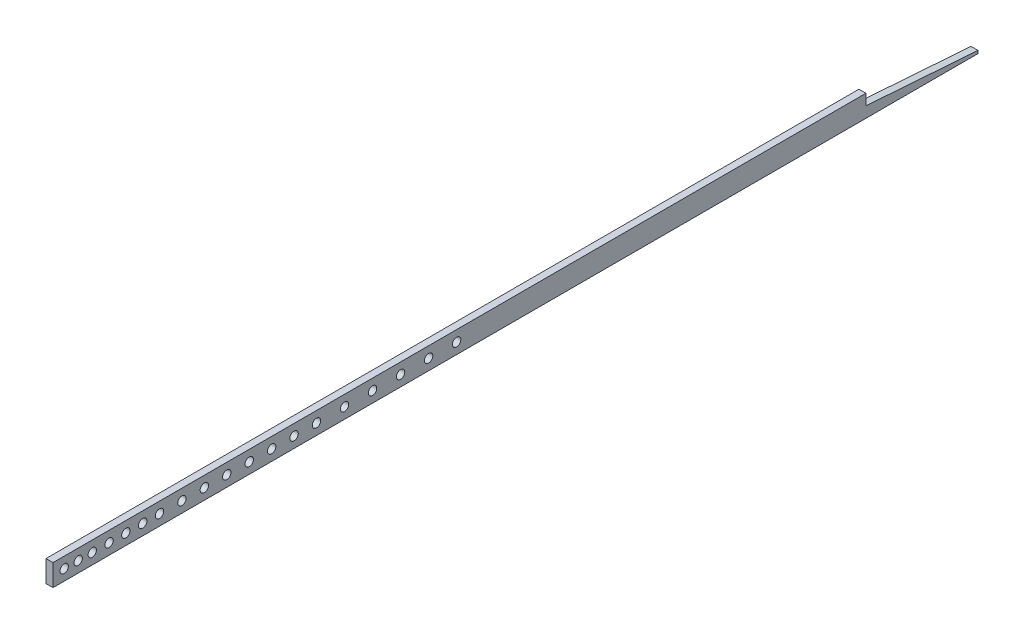
ISO-10303-21;
HEADER;
FILE_DESCRIPTION(('STEP AP214'),'2;1');
FILE_NAME('part.step','',(''),(''),'','','');
FILE_SCHEMA(('AUTOMOTIVE_DESIGN { 1 0 10303 214 1 1 1 1 }'));
ENDSEC;
DATA;
#1=APPLICATION_CONTEXT('core data for automotive mechanical design processes');
#2=APPLICATION_PROTOCOL_DEFINITION('international standard','automotive_design',2000,#1);
#3=PRODUCT_CONTEXT('',#1,'mechanical');
#4=PRODUCT('Part','Part','',(#3));
#5=PRODUCT_RELATED_PRODUCT_CATEGORY('part','',(#4));
#6=PRODUCT_DEFINITION_FORMATION('','',#4);
#7=PRODUCT_DEFINITION_CONTEXT('part definition',#1,'design');
#8=PRODUCT_DEFINITION('design','',#6,#7);
#9=PRODUCT_DEFINITION_SHAPE('','',#8);
#10=(LENGTH_UNIT() NAMED_UNIT(*) SI_UNIT(.MILLI.,.METRE.));
#11=(NAMED_UNIT(*) PLANE_ANGLE_UNIT() SI_UNIT($,.RADIAN.));
#12=(NAMED_UNIT(*) SI_UNIT($,.STERADIAN.) SOLID_ANGLE_UNIT());
#13=UNCERTAINTY_MEASURE_WITH_UNIT(LENGTH_MEASURE(1.E-05),#10,'distance_accuracy_value','');
#14=(GEOMETRIC_REPRESENTATION_CONTEXT(3) GLOBAL_UNCERTAINTY_ASSIGNED_CONTEXT((#13)) GLOBAL_UNIT_ASSIGNED_CONTEXT((#10,
#11,#12)) REPRESENTATION_CONTEXT('',''));
#15=CARTESIAN_POINT('',(0.,0.,0.));
#16=DIRECTION('',(0.,0.,1.));
#17=DIRECTION('',(1.,0.,0.));
#18=AXIS2_PLACEMENT_3D('',#15,#16,#17);
#19=CARTESIAN_POINT('',(0.,0.,0.));
#20=DIRECTION('',(0.,0.,-1.));
#21=DIRECTION('',(-1.,0.,0.));
#22=AXIS2_PLACEMENT_3D('',#19,#20,#21);
#23=PLANE('',#22);
#24=DIRECTION('',(0.,1.,0.));
#25=VECTOR('',#24,1.);
#26=CARTESIAN_POINT('',(5.,0.,0.));
#27=LINE('',#26,#25);
#28=CARTESIAN_POINT('',(5.,7.75,0.));
#29=VERTEX_POINT('',#28);
#30=CARTESIAN_POINT('',(5.,15.5,0.));
#31=VERTEX_POINT('',#30);
#32=EDGE_CURVE('E107',#29,#31,#27,.T.);
#33=ORIENTED_EDGE('',*,*,#32,.F.);
#34=DIRECTION('',(-1.,0.,0.));
#35=VECTOR('',#34,1.);
#36=CARTESIAN_POINT('',(5.,7.75,0.));
#37=LINE('',#36,#35);
#38=CARTESIAN_POINT('',(0.,7.75,0.));
#39=VERTEX_POINT('',#38);
#40=EDGE_CURVE('E92',#29,#39,#37,.T.);
#41=ORIENTED_EDGE('',*,*,#40,.T.);
#42=DIRECTION('',(0.,-1.,0.));
#43=VECTOR('',#42,1.);
#44=CARTESIAN_POINT('',(0.,0.,0.));
#45=LINE('',#44,#43);
#46=CARTESIAN_POINT('',(0.,15.5,0.));
#47=VERTEX_POINT('',#46);
#48=EDGE_CURVE('E111',#47,#39,#45,.T.);
#49=ORIENTED_EDGE('',*,*,#48,.F.);
#50=DIRECTION('',(-1.,0.,0.));
#51=VECTOR('',#50,1.);
#52=CARTESIAN_POINT('',(0.,15.5,0.));
#53=LINE('',#52,#51);
#54=EDGE_CURVE('E72',#31,#47,#53,.T.);
#55=ORIENTED_EDGE('',*,*,#54,.F.);
#56=EDGE_LOOP('',(#33,#41,#49,#55));
#57=FACE_BOUND('',#56,.T.);
#58=ADVANCED_FACE('F33',(#57),#23,.T.);
#59=CARTESIAN_POINT('',(0.,0.,580.));
#60=DIRECTION('',(1.,0.,0.));
#61=DIRECTION('',(0.,0.,-1.));
#62=AXIS2_PLACEMENT_3D('',#59,#60,#61);
#63=PLANE('',#62);
#64=CARTESIAN_POINT('',(0.,7.75,572.));
#65=DIRECTION('',(-1.,0.,0.));
#66=DIRECTION('',(0.,0.,1.));
#67=AXIS2_PLACEMENT_3D('',#64,#65,#66);
#68=CIRCLE('',#67,2.99999999999994);
#69=CARTESIAN_POINT('',(0.,7.75,575.));
#70=VERTEX_POINT('',#69);
#71=EDGE_CURVE('E156',#70,#70,#68,.T.);
#72=ORIENTED_EDGE('',*,*,#71,.F.);
#73=EDGE_LOOP('',(#72));
#74=FACE_BOUND('',#73,.T.);
#75=CARTESIAN_POINT('',(0.,7.74999999999993,562.));
#76=DIRECTION('',(-1.,0.,0.));
#77=DIRECTION('',(0.,0.,1.));
#78=AXIS2_PLACEMENT_3D('',#75,#76,#77);
#79=CIRCLE('',#78,3.00000000000005);
#80=CARTESIAN_POINT('',(0.,7.74999999999993,565.));
#81=VERTEX_POINT('',#80);
#82=EDGE_CURVE('E160',#81,#81,#79,.T.);
#83=ORIENTED_EDGE('',*,*,#82,.F.);
#84=EDGE_LOOP('',(#83));
#85=FACE_BOUND('',#84,.T.);
#86=CARTESIAN_POINT('',(0.,7.74999999999986,552.));
#87=DIRECTION('',(-1.,0.,0.));
#88=DIRECTION('',(0.,0.,1.));
#89=AXIS2_PLACEMENT_3D('',#86,#87,#88);
#90=CIRCLE('',#89,3.00000000000005);
#91=CARTESIAN_POINT('',(0.,7.74999999999986,555.));
#92=VERTEX_POINT('',#91);
#93=EDGE_CURVE('E164',#92,#92,#90,.T.);
#94=ORIENTED_EDGE('',*,*,#93,.F.);
#95=EDGE_LOOP('',(#94));
#96=FACE_BOUND('',#95,.T.);
#97=CARTESIAN_POINT('',(0.,7.74999999999978,540.));
#98=DIRECTION('',(-1.,0.,0.));
#99=DIRECTION('',(0.,0.,1.));
#100=AXIS2_PLACEMENT_3D('',#97,#98,#99);
#101=CIRCLE('',#100,3.00000000000005);
#102=CARTESIAN_POINT('',(0.,7.74999999999978,543.));
#103=VERTEX_POINT('',#102);
#104=EDGE_CURVE('E168',#103,#103,#101,.T.);
#105=ORIENTED_EDGE('',*,*,#104,.F.);
#106=EDGE_LOOP('',(#105));
#107=FACE_BOUND('',#106,.T.);
#108=CARTESIAN_POINT('',(0.,7.74999999999969,528.));
#109=DIRECTION('',(-1.,0.,0.));
#110=DIRECTION('',(0.,0.,1.));
#111=AXIS2_PLACEMENT_3D('',#108,#109,#110);
#112=CIRCLE('',#111,3.00000000000005);
#113=CARTESIAN_POINT('',(0.,7.74999999999969,531.));
#114=VERTEX_POINT('',#113);
#115=EDGE_CURVE('E172',#114,#114,#112,.T.);
#116=ORIENTED_EDGE('',*,*,#115,.F.);
#117=EDGE_LOOP('',(#116));
#118=FACE_BOUND('',#117,.T.);
#119=CARTESIAN_POINT('',(0.,7.74999999999961,516.));
#120=DIRECTION('',(-1.,0.,0.));
#121=DIRECTION('',(0.,0.,1.));
#122=AXIS2_PLACEMENT_3D('',#119,#120,#121);
#123=CIRCLE('',#122,3.00000000000005);
#124=CARTESIAN_POINT('',(0.,7.74999999999961,519.));
#125=VERTEX_POINT('',#124);
#126=EDGE_CURVE('E176',#125,#125,#123,.T.);
#127=ORIENTED_EDGE('',*,*,#126,.F.);
#128=EDGE_LOOP('',(#127));
#129=FACE_BOUND('',#128,.T.);
#130=CARTESIAN_POINT('',(0.,7.74999999999952,504.));
#131=DIRECTION('',(-1.,0.,0.));
#132=DIRECTION('',(0.,0.,1.));
#133=AXIS2_PLACEMENT_3D('',#130,#131,#132);
#134=CIRCLE('',#133,3.00000000000005);
#135=CARTESIAN_POINT('',(0.,7.74999999999952,507.));
#136=VERTEX_POINT('',#135);
#137=EDGE_CURVE('E180',#136,#136,#134,.T.);
#138=ORIENTED_EDGE('',*,*,#137,.F.);
#139=EDGE_LOOP('',(#138));
#140=FACE_BOUND('',#139,.T.);
#141=CARTESIAN_POINT('',(0.,7.74999999999941,488.));
#142=DIRECTION('',(-1.,0.,0.));
#143=DIRECTION('',(0.,0.,1.));
#144=AXIS2_PLACEMENT_3D('',#141,#142,#143);
#145=CIRCLE('',#144,3.00000000000005);
#146=CARTESIAN_POINT('',(0.,7.74999999999941,491.));
#147=VERTEX_POINT('',#146);
#148=EDGE_CURVE('E184',#147,#147,#145,.T.);
#149=ORIENTED_EDGE('',*,*,#148,.F.);
#150=EDGE_LOOP('',(#149));
#151=FACE_BOUND('',#150,.T.);
#152=CARTESIAN_POINT('',(0.,7.7499999999993,472.));
#153=DIRECTION('',(-1.,0.,0.));
#154=DIRECTION('',(0.,0.,1.));
#155=AXIS2_PLACEMENT_3D('',#152,#153,#154);
#156=CIRCLE('',#155,3.00000000000005);
#157=CARTESIAN_POINT('',(0.,7.7499999999993,475.));
#158=VERTEX_POINT('',#157);
#159=EDGE_CURVE('E188',#158,#158,#156,.T.);
#160=ORIENTED_EDGE('',*,*,#159,.F.);
#161=EDGE_LOOP('',(#160));
#162=FACE_BOUND('',#161,.T.);
#163=CARTESIAN_POINT('',(0.,7.74999999999919,456.));
#164=DIRECTION('',(-1.,0.,0.));
#165=DIRECTION('',(0.,0.,1.));
#166=AXIS2_PLACEMENT_3D('',#163,#164,#165);
#167=CIRCLE('',#166,3.00000000000005);
#168=CARTESIAN_POINT('',(0.,7.74999999999919,459.));
#169=VERTEX_POINT('',#168);
#170=EDGE_CURVE('E192',#169,#169,#167,.T.);
#171=ORIENTED_EDGE('',*,*,#170,.F.);
#172=EDGE_LOOP('',(#171));
#173=FACE_BOUND('',#172,.T.);
#174=CARTESIAN_POINT('',(0.,7.74999999999908,440.));
#175=DIRECTION('',(-1.,0.,0.));
#176=DIRECTION('',(0.,0.,1.));
#177=AXIS2_PLACEMENT_3D('',#174,#175,#176);
#178=CIRCLE('',#177,3.00000000000005);
#179=CARTESIAN_POINT('',(0.,7.74999999999908,443.));
#180=VERTEX_POINT('',#179);
#181=EDGE_CURVE('E196',#180,#180,#178,.T.);
#182=ORIENTED_EDGE('',*,*,#181,.F.);
#183=EDGE_LOOP('',(#182));
#184=FACE_BOUND('',#183,.T.);
#185=CARTESIAN_POINT('',(0.,7.74999999999897,424.));
#186=DIRECTION('',(-1.,0.,0.));
#187=DIRECTION('',(0.,0.,1.));
#188=AXIS2_PLACEMENT_3D('',#185,#186,#187);
#189=CIRCLE('',#188,3.00000000000005);
#190=CARTESIAN_POINT('',(0.,7.74999999999897,427.));
#191=VERTEX_POINT('',#190);
#192=EDGE_CURVE('E200',#191,#191,#189,.T.);
#193=ORIENTED_EDGE('',*,*,#192,.F.);
#194=EDGE_LOOP('',(#193));
#195=FACE_BOUND('',#194,.T.);
#196=CARTESIAN_POINT('',(0.,7.74999999999885,408.));
#197=DIRECTION('',(-1.,0.,0.));
#198=DIRECTION('',(0.,0.,1.));
#199=AXIS2_PLACEMENT_3D('',#196,#197,#198);
#200=CIRCLE('',#199,3.00000000000005);
#201=CARTESIAN_POINT('',(0.,7.74999999999885,411.));
#202=VERTEX_POINT('',#201);
#203=EDGE_CURVE('E204',#202,#202,#200,.T.);
#204=ORIENTED_EDGE('',*,*,#203,.F.);
#205=EDGE_LOOP('',(#204));
#206=FACE_BOUND('',#205,.T.);
#207=CARTESIAN_POINT('',(0.,7.74999999999874,392.));
#208=DIRECTION('',(-1.,0.,0.));
#209=DIRECTION('',(0.,0.,1.));
#210=AXIS2_PLACEMENT_3D('',#207,#208,#209);
#211=CIRCLE('',#210,3.00000000000005);
#212=CARTESIAN_POINT('',(0.,7.74999999999874,395.));
#213=VERTEX_POINT('',#212);
#214=EDGE_CURVE('E208',#213,#213,#211,.T.);
#215=ORIENTED_EDGE('',*,*,#214,.F.);
#216=EDGE_LOOP('',(#215));
#217=FACE_BOUND('',#216,.T.);
#218=CARTESIAN_POINT('',(0.,7.7499999999986,372.));
#219=DIRECTION('',(-1.,0.,0.));
#220=DIRECTION('',(0.,0.,1.));
#221=AXIS2_PLACEMENT_3D('',#218,#219,#220);
#222=CIRCLE('',#221,3.00000000000005);
#223=CARTESIAN_POINT('',(0.,7.7499999999986,375.));
#224=VERTEX_POINT('',#223);
#225=EDGE_CURVE('E212',#224,#224,#222,.T.);
#226=ORIENTED_EDGE('',*,*,#225,.F.);
#227=EDGE_LOOP('',(#226));
#228=FACE_BOUND('',#227,.T.);
#229=CARTESIAN_POINT('',(0.,7.74999999999846,352.));
#230=DIRECTION('',(-1.,0.,0.));
#231=DIRECTION('',(0.,0.,1.));
#232=AXIS2_PLACEMENT_3D('',#229,#230,#231);
#233=CIRCLE('',#232,3.00000000000005);
#234=CARTESIAN_POINT('',(0.,7.74999999999846,355.));
#235=VERTEX_POINT('',#234);
#236=EDGE_CURVE('E216',#235,#235,#233,.T.);
#237=ORIENTED_EDGE('',*,*,#236,.F.);
#238=EDGE_LOOP('',(#237));
#239=FACE_BOUND('',#238,.T.);
#240=CARTESIAN_POINT('',(0.,7.74999999999832,332.));
#241=DIRECTION('',(-1.,0.,0.));
#242=DIRECTION('',(0.,0.,1.));
#243=AXIS2_PLACEMENT_3D('',#240,#241,#242);
#244=CIRCLE('',#243,3.00000000000005);
#245=CARTESIAN_POINT('',(0.,7.74999999999832,335.));
#246=VERTEX_POINT('',#245);
#247=EDGE_CURVE('E220',#246,#246,#244,.T.);
#248=ORIENTED_EDGE('',*,*,#247,.F.);
#249=EDGE_LOOP('',(#248));
#250=FACE_BOUND('',#249,.T.);
#251=CARTESIAN_POINT('',(0.,7.74999999999818,312.));
#252=DIRECTION('',(-1.,0.,0.));
#253=DIRECTION('',(0.,0.,1.));
#254=AXIS2_PLACEMENT_3D('',#251,#252,#253);
#255=CIRCLE('',#254,3.00000000000005);
#256=CARTESIAN_POINT('',(0.,7.74999999999818,315.));
#257=VERTEX_POINT('',#256);
#258=EDGE_CURVE('E224',#257,#257,#255,.T.);
#259=ORIENTED_EDGE('',*,*,#258,.F.);
#260=EDGE_LOOP('',(#259));
#261=FACE_BOUND('',#260,.T.);
#262=CARTESIAN_POINT('',(0.,7.74999999999804,292.));
#263=DIRECTION('',(-1.,0.,0.));
#264=DIRECTION('',(0.,0.,1.));
#265=AXIS2_PLACEMENT_3D('',#262,#263,#264);
#266=CIRCLE('',#265,3.00000000000005);
#267=CARTESIAN_POINT('',(0.,7.74999999999804,295.));
#268=VERTEX_POINT('',#267);
#269=EDGE_CURVE('E227',#268,#268,#266,.T.);
#270=ORIENTED_EDGE('',*,*,#269,.F.);
#271=EDGE_LOOP('',(#270));
#272=FACE_BOUND('',#271,.T.);
#273=ORIENTED_EDGE('',*,*,#48,.T.);
#274=DIRECTION('',(0.,-0.0716900625481229,-0.997426957191275));
#275=VECTOR('',#274,1.);
#276=CARTESIAN_POINT('',(0.,7.75,0.));
#277=LINE('',#276,#275);
#278=CARTESIAN_POINT('',(0.,2.,-80.));
#279=VERTEX_POINT('',#278);
#280=EDGE_CURVE('E48',#39,#279,#277,.T.);
#281=ORIENTED_EDGE('',*,*,#280,.T.);
#282=DIRECTION('',(0.,-1.,0.));
#283=VECTOR('',#282,1.);
#284=CARTESIAN_POINT('',(0.,2.,-80.));
#285=LINE('',#284,#283);
#286=CARTESIAN_POINT('',(0.,0.,-80.));
#287=VERTEX_POINT('',#286);
#288=EDGE_CURVE('E109',#279,#287,#285,.T.);
#289=ORIENTED_EDGE('',*,*,#288,.T.);
#290=DIRECTION('',(0.,0.,-1.));
#291=VECTOR('',#290,1.);
#292=CARTESIAN_POINT('',(0.,0.,580.));
#293=LINE('',#292,#291);
#294=CARTESIAN_POINT('',(0.,0.,580.));
#295=VERTEX_POINT('',#294);
#296=EDGE_CURVE('E11',#295,#287,#293,.T.);
#297=ORIENTED_EDGE('',*,*,#296,.F.);
#298=DIRECTION('',(0.,-1.,0.));
#299=VECTOR('',#298,1.);
#300=CARTESIAN_POINT('',(0.,0.,580.));
#301=LINE('',#300,#299);
#302=CARTESIAN_POINT('',(0.,15.5,580.));
#303=VERTEX_POINT('',#302);
#304=EDGE_CURVE('E113',#303,#295,#301,.T.);
#305=ORIENTED_EDGE('',*,*,#304,.F.);
#306=DIRECTION('',(0.,0.,-1.));
#307=VECTOR('',#306,1.);
#308=CARTESIAN_POINT('',(0.,15.5,580.));
#309=LINE('',#308,#307);
#310=EDGE_CURVE('E119',#303,#47,#309,.T.);
#311=ORIENTED_EDGE('',*,*,#310,.T.);
#312=EDGE_LOOP('',(#273,#281,#289,#297,#305,#311));
#313=FACE_BOUND('',#312,.T.);
#314=ADVANCED_FACE('F35',(#74,#85,#96,#107,#118,#129,#140,#151,#162,#173,#184,#195,#206,#217,
#228,#239,#250,#261,#272,#313),#63,.F.);
#315=CARTESIAN_POINT('',(0.,0.,580.));
#316=DIRECTION('',(0.,1.,0.));
#317=DIRECTION('',(0.,0.,1.));
#318=AXIS2_PLACEMENT_3D('',#315,#316,#317);
#319=PLANE('',#318);
#320=ORIENTED_EDGE('',*,*,#296,.T.);
#321=DIRECTION('',(-1.,0.,0.));
#322=VECTOR('',#321,1.);
#323=CARTESIAN_POINT('',(5.,0.,-80.));
#324=LINE('',#323,#322);
#325=CARTESIAN_POINT('',(5.,0.,-80.));
#326=VERTEX_POINT('',#325);
#327=EDGE_CURVE('E115',#326,#287,#324,.T.);
#328=ORIENTED_EDGE('',*,*,#327,.F.);
#329=DIRECTION('',(0.,0.,-1.));
#330=VECTOR('',#329,1.);
#331=CARTESIAN_POINT('',(5.,0.,580.));
#332=LINE('',#331,#330);
#333=CARTESIAN_POINT('',(5.,0.,580.));
#334=VERTEX_POINT('',#333);
#335=EDGE_CURVE('E41',#334,#326,#332,.T.);
#336=ORIENTED_EDGE('',*,*,#335,.F.);
#337=DIRECTION('',(1.,0.,0.));
#338=VECTOR('',#337,1.);
#339=CARTESIAN_POINT('',(0.,0.,580.));
#340=LINE('',#339,#338);
#341=EDGE_CURVE('E79',#295,#334,#340,.T.);
#342=ORIENTED_EDGE('',*,*,#341,.F.);
#343=EDGE_LOOP('',(#320,#328,#336,#342));
#344=FACE_BOUND('',#343,.T.);
#345=ADVANCED_FACE('F126',(#344),#319,.F.);
#346=CARTESIAN_POINT('',(5.,0.,580.));
#347=DIRECTION('',(-1.,0.,0.));
#348=DIRECTION('',(0.,0.,1.));
#349=AXIS2_PLACEMENT_3D('',#346,#347,#348);
#350=PLANE('',#349);
#351=CARTESIAN_POINT('',(5.,7.75,572.));
#352=DIRECTION('',(-1.,0.,0.));
#353=DIRECTION('',(0.,0.,1.));
#354=AXIS2_PLACEMENT_3D('',#351,#352,#353);
#355=CIRCLE('',#354,2.99999999999994);
#356=CARTESIAN_POINT('',(5.,7.75,575.));
#357=VERTEX_POINT('',#356);
#358=EDGE_CURVE('E137',#357,#357,#355,.T.);
#359=ORIENTED_EDGE('',*,*,#358,.T.);
#360=EDGE_LOOP('',(#359));
#361=FACE_BOUND('',#360,.T.);
#362=CARTESIAN_POINT('',(5.,7.74999999999993,562.));
#363=DIRECTION('',(-1.,0.,0.));
#364=DIRECTION('',(0.,0.,1.));
#365=AXIS2_PLACEMENT_3D('',#362,#363,#364);
#366=CIRCLE('',#365,3.00000000000005);
#367=CARTESIAN_POINT('',(5.,7.74999999999993,565.));
#368=VERTEX_POINT('',#367);
#369=EDGE_CURVE('E298',#368,#368,#366,.T.);
#370=ORIENTED_EDGE('',*,*,#369,.T.);
#371=EDGE_LOOP('',(#370));
#372=FACE_BOUND('',#371,.T.);
#373=CARTESIAN_POINT('',(5.,7.74999999999986,552.));
#374=DIRECTION('',(-1.,0.,0.));
#375=DIRECTION('',(0.,0.,1.));
#376=AXIS2_PLACEMENT_3D('',#373,#374,#375);
#377=CIRCLE('',#376,3.00000000000005);
#378=CARTESIAN_POINT('',(5.,7.74999999999986,555.));
#379=VERTEX_POINT('',#378);
#380=EDGE_CURVE('E294',#379,#379,#377,.T.);
#381=ORIENTED_EDGE('',*,*,#380,.T.);
#382=EDGE_LOOP('',(#381));
#383=FACE_BOUND('',#382,.T.);
#384=CARTESIAN_POINT('',(5.,7.74999999999978,540.));
#385=DIRECTION('',(-1.,0.,0.));
#386=DIRECTION('',(0.,0.,1.));
#387=AXIS2_PLACEMENT_3D('',#384,#385,#386);
#388=CIRCLE('',#387,3.00000000000005);
#389=CARTESIAN_POINT('',(5.,7.74999999999978,543.));
#390=VERTEX_POINT('',#389);
#391=EDGE_CURVE('E290',#390,#390,#388,.T.);
#392=ORIENTED_EDGE('',*,*,#391,.T.);
#393=EDGE_LOOP('',(#392));
#394=FACE_BOUND('',#393,.T.);
#395=CARTESIAN_POINT('',(5.,7.74999999999969,528.));
#396=DIRECTION('',(-1.,0.,0.));
#397=DIRECTION('',(0.,0.,1.));
#398=AXIS2_PLACEMENT_3D('',#395,#396,#397);
#399=CIRCLE('',#398,3.00000000000005);
#400=CARTESIAN_POINT('',(5.,7.74999999999969,531.));
#401=VERTEX_POINT('',#400);
#402=EDGE_CURVE('E286',#401,#401,#399,.T.);
#403=ORIENTED_EDGE('',*,*,#402,.T.);
#404=EDGE_LOOP('',(#403));
#405=FACE_BOUND('',#404,.T.);
#406=CARTESIAN_POINT('',(5.,7.74999999999961,516.));
#407=DIRECTION('',(-1.,0.,0.));
#408=DIRECTION('',(0.,0.,1.));
#409=AXIS2_PLACEMENT_3D('',#406,#407,#408);
#410=CIRCLE('',#409,3.00000000000005);
#411=CARTESIAN_POINT('',(5.,7.74999999999961,519.));
#412=VERTEX_POINT('',#411);
#413=EDGE_CURVE('E282',#412,#412,#410,.T.);
#414=ORIENTED_EDGE('',*,*,#413,.T.);
#415=EDGE_LOOP('',(#414));
#416=FACE_BOUND('',#415,.T.);
#417=CARTESIAN_POINT('',(5.,7.74999999999952,504.));
#418=DIRECTION('',(-1.,0.,0.));
#419=DIRECTION('',(0.,0.,1.));
#420=AXIS2_PLACEMENT_3D('',#417,#418,#419);
#421=CIRCLE('',#420,3.00000000000005);
#422=CARTESIAN_POINT('',(5.,7.74999999999952,507.));
#423=VERTEX_POINT('',#422);
#424=EDGE_CURVE('E278',#423,#423,#421,.T.);
#425=ORIENTED_EDGE('',*,*,#424,.T.);
#426=EDGE_LOOP('',(#425));
#427=FACE_BOUND('',#426,.T.);
#428=CARTESIAN_POINT('',(5.,7.74999999999941,488.));
#429=DIRECTION('',(-1.,0.,0.));
#430=DIRECTION('',(0.,0.,1.));
#431=AXIS2_PLACEMENT_3D('',#428,#429,#430);
#432=CIRCLE('',#431,3.00000000000005);
#433=CARTESIAN_POINT('',(5.,7.74999999999941,491.));
#434=VERTEX_POINT('',#433);
#435=EDGE_CURVE('E274',#434,#434,#432,.T.);
#436=ORIENTED_EDGE('',*,*,#435,.T.);
#437=EDGE_LOOP('',(#436));
#438=FACE_BOUND('',#437,.T.);
#439=CARTESIAN_POINT('',(5.,7.7499999999993,472.));
#440=DIRECTION('',(-1.,0.,0.));
#441=DIRECTION('',(0.,0.,1.));
#442=AXIS2_PLACEMENT_3D('',#439,#440,#441);
#443=CIRCLE('',#442,3.00000000000005);
#444=CARTESIAN_POINT('',(5.,7.7499999999993,475.));
#445=VERTEX_POINT('',#444);
#446=EDGE_CURVE('E270',#445,#445,#443,.T.);
#447=ORIENTED_EDGE('',*,*,#446,.T.);
#448=EDGE_LOOP('',(#447));
#449=FACE_BOUND('',#448,.T.);
#450=CARTESIAN_POINT('',(5.,7.74999999999919,456.));
#451=DIRECTION('',(-1.,0.,0.));
#452=DIRECTION('',(0.,0.,1.));
#453=AXIS2_PLACEMENT_3D('',#450,#451,#452);
#454=CIRCLE('',#453,3.00000000000005);
#455=CARTESIAN_POINT('',(5.,7.74999999999919,459.));
#456=VERTEX_POINT('',#455);
#457=EDGE_CURVE('E266',#456,#456,#454,.T.);
#458=ORIENTED_EDGE('',*,*,#457,.T.);
#459=EDGE_LOOP('',(#458));
#460=FACE_BOUND('',#459,.T.);
#461=CARTESIAN_POINT('',(5.,7.74999999999908,440.));
#462=DIRECTION('',(-1.,0.,0.));
#463=DIRECTION('',(0.,0.,1.));
#464=AXIS2_PLACEMENT_3D('',#461,#462,#463);
#465=CIRCLE('',#464,3.00000000000005);
#466=CARTESIAN_POINT('',(5.,7.74999999999908,443.));
#467=VERTEX_POINT('',#466);
#468=EDGE_CURVE('E262',#467,#467,#465,.T.);
#469=ORIENTED_EDGE('',*,*,#468,.T.);
#470=EDGE_LOOP('',(#469));
#471=FACE_BOUND('',#470,.T.);
#472=CARTESIAN_POINT('',(5.,7.74999999999897,424.));
#473=DIRECTION('',(-1.,0.,0.));
#474=DIRECTION('',(0.,0.,1.));
#475=AXIS2_PLACEMENT_3D('',#472,#473,#474);
#476=CIRCLE('',#475,3.00000000000005);
#477=CARTESIAN_POINT('',(5.,7.74999999999897,427.));
#478=VERTEX_POINT('',#477);
#479=EDGE_CURVE('E258',#478,#478,#476,.T.);
#480=ORIENTED_EDGE('',*,*,#479,.T.);
#481=EDGE_LOOP('',(#480));
#482=FACE_BOUND('',#481,.T.);
#483=CARTESIAN_POINT('',(5.,7.74999999999885,408.));
#484=DIRECTION('',(-1.,0.,0.));
#485=DIRECTION('',(0.,0.,1.));
#486=AXIS2_PLACEMENT_3D('',#483,#484,#485);
#487=CIRCLE('',#486,3.00000000000005);
#488=CARTESIAN_POINT('',(5.,7.74999999999885,411.));
#489=VERTEX_POINT('',#488);
#490=EDGE_CURVE('E254',#489,#489,#487,.T.);
#491=ORIENTED_EDGE('',*,*,#490,.T.);
#492=EDGE_LOOP('',(#491));
#493=FACE_BOUND('',#492,.T.);
#494=CARTESIAN_POINT('',(5.,7.74999999999874,392.));
#495=DIRECTION('',(-1.,0.,0.));
#496=DIRECTION('',(0.,0.,1.));
#497=AXIS2_PLACEMENT_3D('',#494,#495,#496);
#498=CIRCLE('',#497,3.00000000000005);
#499=CARTESIAN_POINT('',(5.,7.74999999999874,395.));
#500=VERTEX_POINT('',#499);
#501=EDGE_CURVE('E250',#500,#500,#498,.T.);
#502=ORIENTED_EDGE('',*,*,#501,.T.);
#503=EDGE_LOOP('',(#502));
#504=FACE_BOUND('',#503,.T.);
#505=CARTESIAN_POINT('',(5.,7.7499999999986,372.));
#506=DIRECTION('',(-1.,0.,0.));
#507=DIRECTION('',(0.,0.,1.));
#508=AXIS2_PLACEMENT_3D('',#505,#506,#507);
#509=CIRCLE('',#508,3.00000000000005);
#510=CARTESIAN_POINT('',(5.,7.7499999999986,375.));
#511=VERTEX_POINT('',#510);
#512=EDGE_CURVE('E246',#511,#511,#509,.T.);
#513=ORIENTED_EDGE('',*,*,#512,.T.);
#514=EDGE_LOOP('',(#513));
#515=FACE_BOUND('',#514,.T.);
#516=CARTESIAN_POINT('',(5.,7.74999999999846,352.));
#517=DIRECTION('',(-1.,0.,0.));
#518=DIRECTION('',(0.,0.,1.));
#519=AXIS2_PLACEMENT_3D('',#516,#517,#518);
#520=CIRCLE('',#519,3.00000000000005);
#521=CARTESIAN_POINT('',(5.,7.74999999999846,355.));
#522=VERTEX_POINT('',#521);
#523=EDGE_CURVE('E242',#522,#522,#520,.T.);
#524=ORIENTED_EDGE('',*,*,#523,.T.);
#525=EDGE_LOOP('',(#524));
#526=FACE_BOUND('',#525,.T.);
#527=CARTESIAN_POINT('',(5.,7.74999999999832,332.));
#528=DIRECTION('',(-1.,0.,0.));
#529=DIRECTION('',(0.,0.,1.));
#530=AXIS2_PLACEMENT_3D('',#527,#528,#529);
#531=CIRCLE('',#530,3.00000000000005);
#532=CARTESIAN_POINT('',(5.,7.74999999999832,335.));
#533=VERTEX_POINT('',#532);
#534=EDGE_CURVE('E238',#533,#533,#531,.T.);
#535=ORIENTED_EDGE('',*,*,#534,.T.);
#536=EDGE_LOOP('',(#535));
#537=FACE_BOUND('',#536,.T.);
#538=CARTESIAN_POINT('',(5.,7.74999999999818,312.));
#539=DIRECTION('',(-1.,0.,0.));
#540=DIRECTION('',(0.,0.,1.));
#541=AXIS2_PLACEMENT_3D('',#538,#539,#540);
#542=CIRCLE('',#541,3.00000000000005);
#543=CARTESIAN_POINT('',(5.,7.74999999999818,315.));
#544=VERTEX_POINT('',#543);
#545=EDGE_CURVE('E234',#544,#544,#542,.T.);
#546=ORIENTED_EDGE('',*,*,#545,.T.);
#547=EDGE_LOOP('',(#546));
#548=FACE_BOUND('',#547,.T.);
#549=CARTESIAN_POINT('',(5.,7.74999999999804,292.));
#550=DIRECTION('',(-1.,0.,0.));
#551=DIRECTION('',(0.,0.,1.));
#552=AXIS2_PLACEMENT_3D('',#549,#550,#551);
#553=CIRCLE('',#552,3.00000000000005);
#554=CARTESIAN_POINT('',(5.,7.74999999999804,295.));
#555=VERTEX_POINT('',#554);
#556=EDGE_CURVE('E229',#555,#555,#553,.T.);
#557=ORIENTED_EDGE('',*,*,#556,.T.);
#558=EDGE_LOOP('',(#557));
#559=FACE_BOUND('',#558,.T.);
#560=ORIENTED_EDGE('',*,*,#335,.T.);
#561=DIRECTION('',(0.,-1.,0.));
#562=VECTOR('',#561,1.);
#563=CARTESIAN_POINT('',(5.,2.,-80.));
#564=LINE('',#563,#562);
#565=CARTESIAN_POINT('',(5.,2.,-80.));
#566=VERTEX_POINT('',#565);
#567=EDGE_CURVE('E101',#566,#326,#564,.T.);
#568=ORIENTED_EDGE('',*,*,#567,.F.);
#569=DIRECTION('',(0.,-0.0716900625481229,-0.997426957191275));
#570=VECTOR('',#569,1.);
#571=CARTESIAN_POINT('',(5.,7.75,0.));
#572=LINE('',#571,#570);
#573=EDGE_CURVE('E95',#29,#566,#572,.T.);
#574=ORIENTED_EDGE('',*,*,#573,.F.);
#575=ORIENTED_EDGE('',*,*,#32,.T.);
#576=DIRECTION('',(0.,0.,-1.));
#577=VECTOR('',#576,1.);
#578=CARTESIAN_POINT('',(5.,15.5,580.));
#579=LINE('',#578,#577);
#580=CARTESIAN_POINT('',(5.,15.5,580.));
#581=VERTEX_POINT('',#580);
#582=EDGE_CURVE('E121',#581,#31,#579,.T.);
#583=ORIENTED_EDGE('',*,*,#582,.F.);
#584=DIRECTION('',(0.,1.,0.));
#585=VECTOR('',#584,1.);
#586=CARTESIAN_POINT('',(5.,0.,580.));
#587=LINE('',#586,#585);
#588=EDGE_CURVE('E124',#334,#581,#587,.T.);
#589=ORIENTED_EDGE('',*,*,#588,.F.);
#590=EDGE_LOOP('',(#560,#568,#574,#575,#583,#589));
#591=FACE_BOUND('',#590,.T.);
#592=ADVANCED_FACE('F105',(#361,#372,#383,#394,#405,#416,#427,#438,#449,#460,#471,#482,#493,
#504,#515,#526,#537,#548,#559,#591),#350,.F.);
#593=CARTESIAN_POINT('',(0.,15.5,580.));
#594=DIRECTION('',(0.,-1.,0.));
#595=DIRECTION('',(0.,0.,-1.));
#596=AXIS2_PLACEMENT_3D('',#593,#594,#595);
#597=PLANE('',#596);
#598=ORIENTED_EDGE('',*,*,#54,.T.);
#599=ORIENTED_EDGE('',*,*,#310,.F.);
#600=DIRECTION('',(-1.,0.,0.));
#601=VECTOR('',#600,1.);
#602=CARTESIAN_POINT('',(0.,15.5,580.));
#603=LINE('',#602,#601);
#604=EDGE_CURVE('E57',#581,#303,#603,.T.);
#605=ORIENTED_EDGE('',*,*,#604,.F.);
#606=ORIENTED_EDGE('',*,*,#582,.T.);
#607=EDGE_LOOP('',(#598,#599,#605,#606));
#608=FACE_BOUND('',#607,.T.);
#609=ADVANCED_FACE('F143',(#608),#597,.F.);
#610=CARTESIAN_POINT('',(0.,0.,580.));
#611=DIRECTION('',(0.,0.,-1.));
#612=DIRECTION('',(-1.,0.,0.));
#613=AXIS2_PLACEMENT_3D('',#610,#611,#612);
#614=PLANE('',#613);
#615=ORIENTED_EDGE('',*,*,#304,.T.);
#616=ORIENTED_EDGE('',*,*,#341,.T.);
#617=ORIENTED_EDGE('',*,*,#588,.T.);
#618=ORIENTED_EDGE('',*,*,#604,.T.);
#619=EDGE_LOOP('',(#615,#616,#617,#618));
#620=FACE_BOUND('',#619,.T.);
#621=ADVANCED_FACE('F142',(#620),#614,.F.);
#622=CARTESIAN_POINT('',(5.,2.,-80.));
#623=DIRECTION('',(0.,0.,-1.));
#624=DIRECTION('',(-1.,0.,0.));
#625=AXIS2_PLACEMENT_3D('',#622,#623,#624);
#626=PLANE('',#625);
#627=ORIENTED_EDGE('',*,*,#288,.F.);
#628=DIRECTION('',(-1.,0.,0.));
#629=VECTOR('',#628,1.);
#630=CARTESIAN_POINT('',(5.,2.,-80.));
#631=LINE('',#630,#629);
#632=EDGE_CURVE('E100',#566,#279,#631,.T.);
#633=ORIENTED_EDGE('',*,*,#632,.F.);
#634=ORIENTED_EDGE('',*,*,#567,.T.);
#635=ORIENTED_EDGE('',*,*,#327,.T.);
#636=EDGE_LOOP('',(#627,#633,#634,#635));
#637=FACE_BOUND('',#636,.T.);
#638=ADVANCED_FACE('F132',(#637),#626,.T.);
#639=CARTESIAN_POINT('',(5.,7.75,0.));
#640=DIRECTION('',(0.,0.997426957191275,-0.0716900625481229));
#641=DIRECTION('',(0.,0.0716900625481229,0.997426957191275));
#642=AXIS2_PLACEMENT_3D('',#639,#640,#641);
#643=PLANE('',#642);
#644=ORIENTED_EDGE('',*,*,#280,.F.);
#645=ORIENTED_EDGE('',*,*,#40,.F.);
#646=ORIENTED_EDGE('',*,*,#573,.T.);
#647=ORIENTED_EDGE('',*,*,#632,.T.);
#648=EDGE_LOOP('',(#644,#645,#646,#647));
#649=FACE_BOUND('',#648,.T.);
#650=ADVANCED_FACE('F94',(#649),#643,.T.);
#651=CARTESIAN_POINT('',(5.,7.74999999999804,292.));
#652=DIRECTION('',(-1.,0.,0.));
#653=DIRECTION('',(0.,0.,1.));
#654=AXIS2_PLACEMENT_3D('',#651,#652,#653);
#655=CYLINDRICAL_SURFACE('',#654,3.00000000000005);
#656=ORIENTED_EDGE('',*,*,#556,.F.);
#657=EDGE_LOOP('',(#656));
#658=FACE_BOUND('',#657,.T.);
#659=ORIENTED_EDGE('',*,*,#269,.T.);
#660=EDGE_LOOP('',(#659));
#661=FACE_BOUND('',#660,.T.);
#662=ADVANCED_FACE('F381',(#658,#661),#655,.F.);
#663=CARTESIAN_POINT('',(5.,7.74999999999818,312.));
#664=DIRECTION('',(-1.,0.,0.));
#665=DIRECTION('',(0.,0.,1.));
#666=AXIS2_PLACEMENT_3D('',#663,#664,#665);
#667=CYLINDRICAL_SURFACE('',#666,3.00000000000005);
#668=ORIENTED_EDGE('',*,*,#545,.F.);
#669=EDGE_LOOP('',(#668));
#670=FACE_BOUND('',#669,.T.);
#671=ORIENTED_EDGE('',*,*,#258,.T.);
#672=EDGE_LOOP('',(#671));
#673=FACE_BOUND('',#672,.T.);
#674=ADVANCED_FACE('F377',(#670,#673),#667,.F.);
#675=CARTESIAN_POINT('',(5.,7.74999999999832,332.));
#676=DIRECTION('',(-1.,0.,0.));
#677=DIRECTION('',(0.,0.,1.));
#678=AXIS2_PLACEMENT_3D('',#675,#676,#677);
#679=CYLINDRICAL_SURFACE('',#678,3.00000000000005);
#680=ORIENTED_EDGE('',*,*,#534,.F.);
#681=EDGE_LOOP('',(#680));
#682=FACE_BOUND('',#681,.T.);
#683=ORIENTED_EDGE('',*,*,#247,.T.);
#684=EDGE_LOOP('',(#683));
#685=FACE_BOUND('',#684,.T.);
#686=ADVANCED_FACE('F373',(#682,#685),#679,.F.);
#687=CARTESIAN_POINT('',(5.,7.74999999999846,352.));
#688=DIRECTION('',(-1.,0.,0.));
#689=DIRECTION('',(0.,0.,1.));
#690=AXIS2_PLACEMENT_3D('',#687,#688,#689);
#691=CYLINDRICAL_SURFACE('',#690,3.00000000000005);
#692=ORIENTED_EDGE('',*,*,#523,.F.);
#693=EDGE_LOOP('',(#692));
#694=FACE_BOUND('',#693,.T.);
#695=ORIENTED_EDGE('',*,*,#236,.T.);
#696=EDGE_LOOP('',(#695));
#697=FACE_BOUND('',#696,.T.);
#698=ADVANCED_FACE('F369',(#694,#697),#691,.F.);
#699=CARTESIAN_POINT('',(5.,7.7499999999986,372.));
#700=DIRECTION('',(-1.,0.,0.));
#701=DIRECTION('',(0.,0.,1.));
#702=AXIS2_PLACEMENT_3D('',#699,#700,#701);
#703=CYLINDRICAL_SURFACE('',#702,3.00000000000005);
#704=ORIENTED_EDGE('',*,*,#512,.F.);
#705=EDGE_LOOP('',(#704));
#706=FACE_BOUND('',#705,.T.);
#707=ORIENTED_EDGE('',*,*,#225,.T.);
#708=EDGE_LOOP('',(#707));
#709=FACE_BOUND('',#708,.T.);
#710=ADVANCED_FACE('F365',(#706,#709),#703,.F.);
#711=CARTESIAN_POINT('',(5.,7.74999999999874,392.));
#712=DIRECTION('',(-1.,0.,0.));
#713=DIRECTION('',(0.,0.,1.));
#714=AXIS2_PLACEMENT_3D('',#711,#712,#713);
#715=CYLINDRICAL_SURFACE('',#714,3.00000000000005);
#716=ORIENTED_EDGE('',*,*,#501,.F.);
#717=EDGE_LOOP('',(#716));
#718=FACE_BOUND('',#717,.T.);
#719=ORIENTED_EDGE('',*,*,#214,.T.);
#720=EDGE_LOOP('',(#719));
#721=FACE_BOUND('',#720,.T.);
#722=ADVANCED_FACE('F361',(#718,#721),#715,.F.);
#723=CARTESIAN_POINT('',(5.,7.74999999999885,408.));
#724=DIRECTION('',(-1.,0.,0.));
#725=DIRECTION('',(0.,0.,1.));
#726=AXIS2_PLACEMENT_3D('',#723,#724,#725);
#727=CYLINDRICAL_SURFACE('',#726,3.00000000000005);
#728=ORIENTED_EDGE('',*,*,#490,.F.);
#729=EDGE_LOOP('',(#728));
#730=FACE_BOUND('',#729,.T.);
#731=ORIENTED_EDGE('',*,*,#203,.T.);
#732=EDGE_LOOP('',(#731));
#733=FACE_BOUND('',#732,.T.);
#734=ADVANCED_FACE('F357',(#730,#733),#727,.F.);
#735=CARTESIAN_POINT('',(5.,7.74999999999897,424.));
#736=DIRECTION('',(-1.,0.,0.));
#737=DIRECTION('',(0.,0.,1.));
#738=AXIS2_PLACEMENT_3D('',#735,#736,#737);
#739=CYLINDRICAL_SURFACE('',#738,3.00000000000005);
#740=ORIENTED_EDGE('',*,*,#479,.F.);
#741=EDGE_LOOP('',(#740));
#742=FACE_BOUND('',#741,.T.);
#743=ORIENTED_EDGE('',*,*,#192,.T.);
#744=EDGE_LOOP('',(#743));
#745=FACE_BOUND('',#744,.T.);
#746=ADVANCED_FACE('F353',(#742,#745),#739,.F.);
#747=CARTESIAN_POINT('',(5.,7.74999999999908,440.));
#748=DIRECTION('',(-1.,0.,0.));
#749=DIRECTION('',(0.,0.,1.));
#750=AXIS2_PLACEMENT_3D('',#747,#748,#749);
#751=CYLINDRICAL_SURFACE('',#750,3.00000000000005);
#752=ORIENTED_EDGE('',*,*,#468,.F.);
#753=EDGE_LOOP('',(#752));
#754=FACE_BOUND('',#753,.T.);
#755=ORIENTED_EDGE('',*,*,#181,.T.);
#756=EDGE_LOOP('',(#755));
#757=FACE_BOUND('',#756,.T.);
#758=ADVANCED_FACE('F349',(#754,#757),#751,.F.);
#759=CARTESIAN_POINT('',(5.,7.74999999999919,456.));
#760=DIRECTION('',(-1.,0.,0.));
#761=DIRECTION('',(0.,0.,1.));
#762=AXIS2_PLACEMENT_3D('',#759,#760,#761);
#763=CYLINDRICAL_SURFACE('',#762,3.00000000000005);
#764=ORIENTED_EDGE('',*,*,#457,.F.);
#765=EDGE_LOOP('',(#764));
#766=FACE_BOUND('',#765,.T.);
#767=ORIENTED_EDGE('',*,*,#170,.T.);
#768=EDGE_LOOP('',(#767));
#769=FACE_BOUND('',#768,.T.);
#770=ADVANCED_FACE('F345',(#766,#769),#763,.F.);
#771=CARTESIAN_POINT('',(5.,7.7499999999993,472.));
#772=DIRECTION('',(-1.,0.,0.));
#773=DIRECTION('',(0.,0.,1.));
#774=AXIS2_PLACEMENT_3D('',#771,#772,#773);
#775=CYLINDRICAL_SURFACE('',#774,3.00000000000005);
#776=ORIENTED_EDGE('',*,*,#446,.F.);
#777=EDGE_LOOP('',(#776));
#778=FACE_BOUND('',#777,.T.);
#779=ORIENTED_EDGE('',*,*,#159,.T.);
#780=EDGE_LOOP('',(#779));
#781=FACE_BOUND('',#780,.T.);
#782=ADVANCED_FACE('F341',(#778,#781),#775,.F.);
#783=CARTESIAN_POINT('',(5.,7.74999999999941,488.));
#784=DIRECTION('',(-1.,0.,0.));
#785=DIRECTION('',(0.,0.,1.));
#786=AXIS2_PLACEMENT_3D('',#783,#784,#785);
#787=CYLINDRICAL_SURFACE('',#786,3.00000000000005);
#788=ORIENTED_EDGE('',*,*,#435,.F.);
#789=EDGE_LOOP('',(#788));
#790=FACE_BOUND('',#789,.T.);
#791=ORIENTED_EDGE('',*,*,#148,.T.);
#792=EDGE_LOOP('',(#791));
#793=FACE_BOUND('',#792,.T.);
#794=ADVANCED_FACE('F337',(#790,#793),#787,.F.);
#795=CARTESIAN_POINT('',(5.,7.74999999999952,504.));
#796=DIRECTION('',(-1.,0.,0.));
#797=DIRECTION('',(0.,0.,1.));
#798=AXIS2_PLACEMENT_3D('',#795,#796,#797);
#799=CYLINDRICAL_SURFACE('',#798,3.00000000000005);
#800=ORIENTED_EDGE('',*,*,#424,.F.);
#801=EDGE_LOOP('',(#800));
#802=FACE_BOUND('',#801,.T.);
#803=ORIENTED_EDGE('',*,*,#137,.T.);
#804=EDGE_LOOP('',(#803));
#805=FACE_BOUND('',#804,.T.);
#806=ADVANCED_FACE('F333',(#802,#805),#799,.F.);
#807=CARTESIAN_POINT('',(5.,7.74999999999961,516.));
#808=DIRECTION('',(-1.,0.,0.));
#809=DIRECTION('',(0.,0.,1.));
#810=AXIS2_PLACEMENT_3D('',#807,#808,#809);
#811=CYLINDRICAL_SURFACE('',#810,3.00000000000005);
#812=ORIENTED_EDGE('',*,*,#413,.F.);
#813=EDGE_LOOP('',(#812));
#814=FACE_BOUND('',#813,.T.);
#815=ORIENTED_EDGE('',*,*,#126,.T.);
#816=EDGE_LOOP('',(#815));
#817=FACE_BOUND('',#816,.T.);
#818=ADVANCED_FACE('F329',(#814,#817),#811,.F.);
#819=CARTESIAN_POINT('',(5.,7.74999999999969,528.));
#820=DIRECTION('',(-1.,0.,0.));
#821=DIRECTION('',(0.,0.,1.));
#822=AXIS2_PLACEMENT_3D('',#819,#820,#821);
#823=CYLINDRICAL_SURFACE('',#822,3.00000000000005);
#824=ORIENTED_EDGE('',*,*,#402,.F.);
#825=EDGE_LOOP('',(#824));
#826=FACE_BOUND('',#825,.T.);
#827=ORIENTED_EDGE('',*,*,#115,.T.);
#828=EDGE_LOOP('',(#827));
#829=FACE_BOUND('',#828,.T.);
#830=ADVANCED_FACE('F325',(#826,#829),#823,.F.);
#831=CARTESIAN_POINT('',(5.,7.74999999999978,540.));
#832=DIRECTION('',(-1.,0.,0.));
#833=DIRECTION('',(0.,0.,1.));
#834=AXIS2_PLACEMENT_3D('',#831,#832,#833);
#835=CYLINDRICAL_SURFACE('',#834,3.00000000000005);
#836=ORIENTED_EDGE('',*,*,#391,.F.);
#837=EDGE_LOOP('',(#836));
#838=FACE_BOUND('',#837,.T.);
#839=ORIENTED_EDGE('',*,*,#104,.T.);
#840=EDGE_LOOP('',(#839));
#841=FACE_BOUND('',#840,.T.);
#842=ADVANCED_FACE('F321',(#838,#841),#835,.F.);
#843=CARTESIAN_POINT('',(5.,7.74999999999986,552.));
#844=DIRECTION('',(-1.,0.,0.));
#845=DIRECTION('',(0.,0.,1.));
#846=AXIS2_PLACEMENT_3D('',#843,#844,#845);
#847=CYLINDRICAL_SURFACE('',#846,3.00000000000005);
#848=ORIENTED_EDGE('',*,*,#380,.F.);
#849=EDGE_LOOP('',(#848));
#850=FACE_BOUND('',#849,.T.);
#851=ORIENTED_EDGE('',*,*,#93,.T.);
#852=EDGE_LOOP('',(#851));
#853=FACE_BOUND('',#852,.T.);
#854=ADVANCED_FACE('F315',(#850,#853),#847,.F.);
#855=CARTESIAN_POINT('',(5.,7.74999999999993,562.));
#856=DIRECTION('',(-1.,0.,0.));
#857=DIRECTION('',(0.,0.,1.));
#858=AXIS2_PLACEMENT_3D('',#855,#856,#857);
#859=CYLINDRICAL_SURFACE('',#858,3.00000000000005);
#860=ORIENTED_EDGE('',*,*,#369,.F.);
#861=EDGE_LOOP('',(#860));
#862=FACE_BOUND('',#861,.T.);
#863=ORIENTED_EDGE('',*,*,#82,.T.);
#864=EDGE_LOOP('',(#863));
#865=FACE_BOUND('',#864,.T.);
#866=ADVANCED_FACE('F310',(#862,#865),#859,.F.);
#867=CARTESIAN_POINT('',(5.,7.75,572.));
#868=DIRECTION('',(-1.,0.,0.));
#869=DIRECTION('',(0.,0.,1.));
#870=AXIS2_PLACEMENT_3D('',#867,#868,#869);
#871=CYLINDRICAL_SURFACE('',#870,2.99999999999994);
#872=ORIENTED_EDGE('',*,*,#358,.F.);
#873=EDGE_LOOP('',(#872));
#874=FACE_BOUND('',#873,.T.);
#875=ORIENTED_EDGE('',*,*,#71,.T.);
#876=EDGE_LOOP('',(#875));
#877=FACE_BOUND('',#876,.T.);
#878=ADVANCED_FACE('F307',(#874,#877),#871,.F.);
#879=CLOSED_SHELL('',(#58,#314,#345,#592,#609,#621,#638,#650,#662,#674,#686,#698,#710,#722,#734,
#746,#758,#770,#782,#794,#806,#818,#830,#842,#854,#866,#878));
#880=MANIFOLD_SOLID_BREP('B2',#879);
#881=ADVANCED_BREP_SHAPE_REPRESENTATION('',(#18,#880),#14);
#882=SHAPE_DEFINITION_REPRESENTATION(#9,#881);
ENDSEC;
END-ISO-10303-21;
